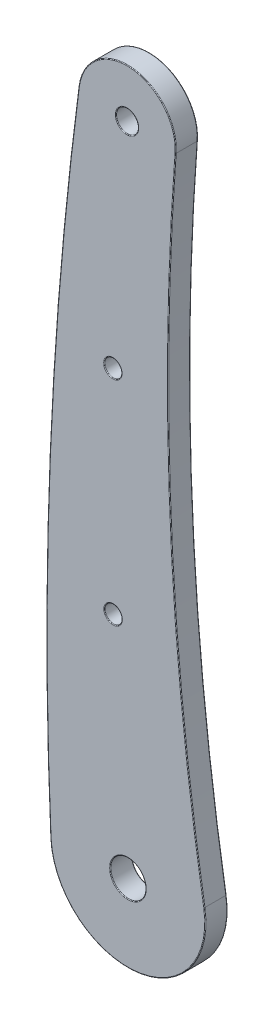
ISO-10303-21;
HEADER;
FILE_DESCRIPTION(('STEP AP214'),'2;1');
FILE_NAME('part.step','',(''),(''),'','','');
FILE_SCHEMA(('AUTOMOTIVE_DESIGN { 1 0 10303 214 1 1 1 1 }'));
ENDSEC;
DATA;
#1=APPLICATION_CONTEXT('core data for automotive mechanical design processes');
#2=APPLICATION_PROTOCOL_DEFINITION('international standard','automotive_design',2000,#1);
#3=PRODUCT_CONTEXT('',#1,'mechanical');
#4=PRODUCT('Part','Part','',(#3));
#5=PRODUCT_RELATED_PRODUCT_CATEGORY('part','',(#4));
#6=PRODUCT_DEFINITION_FORMATION('','',#4);
#7=PRODUCT_DEFINITION_CONTEXT('part definition',#1,'design');
#8=PRODUCT_DEFINITION('design','',#6,#7);
#9=PRODUCT_DEFINITION_SHAPE('','',#8);
#10=(LENGTH_UNIT() NAMED_UNIT(*) SI_UNIT(.MILLI.,.METRE.));
#11=(NAMED_UNIT(*) PLANE_ANGLE_UNIT() SI_UNIT($,.RADIAN.));
#12=(NAMED_UNIT(*) SI_UNIT($,.STERADIAN.) SOLID_ANGLE_UNIT());
#13=UNCERTAINTY_MEASURE_WITH_UNIT(LENGTH_MEASURE(1.E-05),#10,'distance_accuracy_value','');
#14=(GEOMETRIC_REPRESENTATION_CONTEXT(3) GLOBAL_UNCERTAINTY_ASSIGNED_CONTEXT((#13)) GLOBAL_UNIT_ASSIGNED_CONTEXT((#10,
#11,#12)) REPRESENTATION_CONTEXT('',''));
#15=CARTESIAN_POINT('',(0.,0.,0.));
#16=DIRECTION('',(0.,0.,1.));
#17=DIRECTION('',(1.,0.,0.));
#18=AXIS2_PLACEMENT_3D('',#15,#16,#17);
#19=CARTESIAN_POINT('',(-16.0953886048868,338.658157598843,-5.));
#20=DIRECTION('',(0.,0.,1.));
#21=DIRECTION('',(1.,0.,0.));
#22=AXIS2_PLACEMENT_3D('',#19,#20,#21);
#23=CYLINDRICAL_SURFACE('',#22,10.9999999999999);
#24=DIRECTION('',(0.,0.,1.));
#25=VECTOR('',#24,1.);
#26=CARTESIAN_POINT('',(-5.12690314801267,337.826095832905,-5.));
#27=LINE('',#26,#25);
#28=CARTESIAN_POINT('',(-5.12690314801267,337.826095832905,-4.85));
#29=VERTEX_POINT('',#28);
#30=CARTESIAN_POINT('',(-5.12690314801267,337.826095832905,-0.15));
#31=VERTEX_POINT('',#30);
#32=EDGE_CURVE('E105',#29,#31,#27,.T.);
#33=ORIENTED_EDGE('',*,*,#32,.F.);
#34=CARTESIAN_POINT('',(-16.0953886048868,338.658157598843,-4.85));
#35=DIRECTION('',(0.,0.,-1.));
#36=DIRECTION('',(-1.,0.,0.));
#37=AXIS2_PLACEMENT_3D('',#34,#35,#36);
#38=CIRCLE('',#37,10.9999999999999);
#39=CARTESIAN_POINT('',(-27.0011198002621,340.095177812416,-4.85));
#40=VERTEX_POINT('',#39);
#41=EDGE_CURVE('E100',#29,#40,#38,.F.);
#42=ORIENTED_EDGE('',*,*,#41,.T.);
#43=DIRECTION('',(0.,0.,1.));
#44=VECTOR('',#43,1.);
#45=CARTESIAN_POINT('',(-27.0011198002621,340.095177812416,-5.));
#46=LINE('',#45,#44);
#47=CARTESIAN_POINT('',(-27.0011198002621,340.095177812416,-0.15));
#48=VERTEX_POINT('',#47);
#49=EDGE_CURVE('E102',#40,#48,#46,.T.);
#50=ORIENTED_EDGE('',*,*,#49,.T.);
#51=CARTESIAN_POINT('',(-16.0953886048868,338.658157598843,-0.15));
#52=DIRECTION('',(0.,0.,-1.));
#53=DIRECTION('',(-1.,0.,0.));
#54=AXIS2_PLACEMENT_3D('',#51,#52,#53);
#55=CIRCLE('',#54,10.9999999999999);
#56=EDGE_CURVE('E111',#48,#31,#55,.T.);
#57=ORIENTED_EDGE('',*,*,#56,.T.);
#58=EDGE_LOOP('',(#33,#42,#50,#57));
#59=FACE_BOUND('',#58,.T.);
#60=ADVANCED_FACE('F34',(#59),#23,.T.);
#61=CARTESIAN_POINT('',(593.154121772403,292.440908599878,-5.));
#62=DIRECTION('',(0.,0.,1.));
#63=DIRECTION('',(1.,0.,0.));
#64=AXIS2_PLACEMENT_3D('',#61,#62,#63);
#65=CYLINDRICAL_SURFACE('',#64,600.);
#66=DIRECTION('',(0.,0.,1.));
#67=VECTOR('',#66,1.);
#68=CARTESIAN_POINT('',(1.36094250549668,193.542814719524,-5.));
#69=LINE('',#68,#67);
#70=CARTESIAN_POINT('',(1.36094250549668,193.542814719524,-4.85));
#71=VERTEX_POINT('',#70);
#72=CARTESIAN_POINT('',(1.36094250549668,193.542814719524,-0.15));
#73=VERTEX_POINT('',#72);
#74=EDGE_CURVE('E235',#71,#73,#69,.T.);
#75=ORIENTED_EDGE('',*,*,#74,.F.);
#76=CARTESIAN_POINT('',(593.154121772403,292.440908599878,-4.85));
#77=DIRECTION('',(0.,0.,-1.));
#78=DIRECTION('',(-1.,0.,0.));
#79=AXIS2_PLACEMENT_3D('',#76,#77,#78);
#80=CIRCLE('',#79,600.);
#81=EDGE_CURVE('E167',#71,#29,#80,.T.);
#82=ORIENTED_EDGE('',*,*,#81,.T.);
#83=ORIENTED_EDGE('',*,*,#32,.T.);
#84=CARTESIAN_POINT('',(593.154121772403,292.440908599878,-0.15));
#85=DIRECTION('',(0.,0.,-1.));
#86=DIRECTION('',(-1.,0.,0.));
#87=AXIS2_PLACEMENT_3D('',#84,#85,#86);
#88=CIRCLE('',#87,600.);
#89=EDGE_CURVE('E164',#31,#73,#88,.F.);
#90=ORIENTED_EDGE('',*,*,#89,.T.);
#91=EDGE_LOOP('',(#75,#82,#83,#90));
#92=FACE_BOUND('',#91,.T.);
#93=ADVANCED_FACE('F232',(#92),#65,.F.);
#94=CARTESIAN_POINT('',(-15.8996918897889,190.658286981347,-5.));
#95=DIRECTION('',(0.,0.,1.));
#96=DIRECTION('',(1.,0.,0.));
#97=AXIS2_PLACEMENT_3D('',#94,#95,#96);
#98=CYLINDRICAL_SURFACE('',#97,17.5000000000008);
#99=DIRECTION('',(0.,0.,1.));
#100=VECTOR('',#99,1.);
#101=CARTESIAN_POINT('',(-33.3810707222705,189.851197076014,-5.));
#102=LINE('',#101,#100);
#103=CARTESIAN_POINT('',(-33.3810707222705,189.851197076014,-4.85));
#104=VERTEX_POINT('',#103);
#105=CARTESIAN_POINT('',(-33.3810707222705,189.851197076014,-0.15));
#106=VERTEX_POINT('',#105);
#107=EDGE_CURVE('E122',#104,#106,#102,.T.);
#108=ORIENTED_EDGE('',*,*,#107,.F.);
#109=CARTESIAN_POINT('',(-15.8996918897889,190.658286981347,-4.85));
#110=DIRECTION('',(0.,0.,-1.));
#111=DIRECTION('',(-1.,0.,0.));
#112=AXIS2_PLACEMENT_3D('',#109,#110,#111);
#113=CIRCLE('',#112,17.5000000000008);
#114=EDGE_CURVE('E162',#104,#71,#113,.F.);
#115=ORIENTED_EDGE('',*,*,#114,.T.);
#116=ORIENTED_EDGE('',*,*,#74,.T.);
#117=CARTESIAN_POINT('',(-15.8996918897889,190.658286981347,-0.15));
#118=DIRECTION('',(0.,0.,-1.));
#119=DIRECTION('',(-1.,0.,0.));
#120=AXIS2_PLACEMENT_3D('',#117,#118,#119);
#121=CIRCLE('',#120,17.5000000000008);
#122=EDGE_CURVE('E160',#73,#106,#121,.T.);
#123=ORIENTED_EDGE('',*,*,#122,.T.);
#124=EDGE_LOOP('',(#108,#115,#116,#123));
#125=FACE_BOUND('',#124,.T.);
#126=ADVANCED_FACE('F279',(#125),#98,.T.);
#127=CARTESIAN_POINT('',(815.714472569655,229.052706763638,-5.));
#128=DIRECTION('',(0.,0.,1.));
#129=DIRECTION('',(1.,0.,0.));
#130=AXIS2_PLACEMENT_3D('',#127,#128,#129);
#131=CYLINDRICAL_SURFACE('',#130,850.);
#132=ORIENTED_EDGE('',*,*,#49,.F.);
#133=CARTESIAN_POINT('',(815.714472569655,229.052706763638,-4.85));
#134=DIRECTION('',(0.,0.,-1.));
#135=DIRECTION('',(-1.,0.,0.));
#136=AXIS2_PLACEMENT_3D('',#133,#134,#135);
#137=CIRCLE('',#136,850.);
#138=EDGE_CURVE('E118',#40,#104,#137,.F.);
#139=ORIENTED_EDGE('',*,*,#138,.T.);
#140=ORIENTED_EDGE('',*,*,#107,.T.);
#141=CARTESIAN_POINT('',(815.714472569655,229.052706763638,-0.15));
#142=DIRECTION('',(0.,0.,-1.));
#143=DIRECTION('',(-1.,0.,0.));
#144=AXIS2_PLACEMENT_3D('',#141,#142,#143);
#145=CIRCLE('',#144,850.);
#146=EDGE_CURVE('E121',#106,#48,#145,.T.);
#147=ORIENTED_EDGE('',*,*,#146,.T.);
#148=EDGE_LOOP('',(#132,#139,#140,#147));
#149=FACE_BOUND('',#148,.T.);
#150=ADVANCED_FACE('F115',(#149),#131,.T.);
#151=CARTESIAN_POINT('',(288.529366583758,315.549533099361,-5.));
#152=DIRECTION('',(0.,0.,-1.));
#153=DIRECTION('',(-1.,0.,0.));
#154=AXIS2_PLACEMENT_3D('',#151,#152,#153);
#155=PLANE('',#154);
#156=CARTESIAN_POINT('',(-15.8996918897889,190.658286981347,-5.));
#157=DIRECTION('',(0.,0.,-1.));
#158=DIRECTION('',(-1.,0.,0.));
#159=AXIS2_PLACEMENT_3D('',#156,#157,#158);
#160=CIRCLE('',#159,17.3500000000008);
#161=CARTESIAN_POINT('',(1.21299421068002,193.518090196054,-5.));
#162=VERTEX_POINT('',#161);
#163=CARTESIAN_POINT('',(-33.2312303322778,189.858114989488,-5.));
#164=VERTEX_POINT('',#163);
#165=EDGE_CURVE('E156',#162,#164,#160,.T.);
#166=ORIENTED_EDGE('',*,*,#165,.T.);
#167=CARTESIAN_POINT('',(815.714472569655,229.052706763638,-5.));
#168=DIRECTION('',(0.,0.,-1.));
#169=DIRECTION('',(-1.,0.,0.));
#170=AXIS2_PLACEMENT_3D('',#167,#168,#169);
#171=CIRCLE('',#170,849.85);
#172=CARTESIAN_POINT('',(-26.8524052839616,340.075582082231,-5.));
#173=VERTEX_POINT('',#172);
#174=EDGE_CURVE('E158',#164,#173,#171,.T.);
#175=ORIENTED_EDGE('',*,*,#174,.T.);
#176=CARTESIAN_POINT('',(-16.0953886048868,338.658157598843,-5.));
#177=DIRECTION('',(0.,0.,-1.));
#178=DIRECTION('',(-1.,0.,0.));
#179=AXIS2_PLACEMENT_3D('',#176,#177,#178);
#180=CIRCLE('',#179,10.8499999999999);
#181=CARTESIAN_POINT('',(-5.27647340424266,337.837442129713,-5.));
#182=VERTEX_POINT('',#181);
#183=EDGE_CURVE('E128',#173,#182,#180,.T.);
#184=ORIENTED_EDGE('',*,*,#183,.T.);
#185=CARTESIAN_POINT('',(593.154121772403,292.440908599878,-5.));
#186=DIRECTION('',(0.,0.,-1.));
#187=DIRECTION('',(-1.,0.,0.));
#188=AXIS2_PLACEMENT_3D('',#185,#186,#187);
#189=CIRCLE('',#188,600.15);
#190=EDGE_CURVE('E154',#182,#162,#189,.F.);
#191=ORIENTED_EDGE('',*,*,#190,.T.);
#192=EDGE_LOOP('',(#166,#175,#184,#191));
#193=FACE_BOUND('',#192,.T.);
#194=CARTESIAN_POINT('',(-16.0953886048868,338.658157598843,-5.));
#195=DIRECTION('',(0.,0.,-1.));
#196=DIRECTION('',(-1.,0.,0.));
#197=AXIS2_PLACEMENT_3D('',#194,#195,#196);
#198=CIRCLE('',#197,2.65);
#199=CARTESIAN_POINT('',(-18.7453886048868,338.658157598843,-5.));
#200=VERTEX_POINT('',#199);
#201=EDGE_CURVE('E150',#200,#200,#198,.F.);
#202=ORIENTED_EDGE('',*,*,#201,.T.);
#203=EDGE_LOOP('',(#202));
#204=FACE_BOUND('',#203,.T.);
#205=CARTESIAN_POINT('',(-15.8996918897889,190.658286981347,-5.));
#206=DIRECTION('',(0.,0.,-1.));
#207=DIRECTION('',(-1.,0.,0.));
#208=AXIS2_PLACEMENT_3D('',#205,#206,#207);
#209=CIRCLE('',#208,4.14999999999996);
#210=CARTESIAN_POINT('',(-20.0496918897888,190.658286981347,-5.));
#211=VERTEX_POINT('',#210);
#212=EDGE_CURVE('E147',#211,#211,#209,.F.);
#213=ORIENTED_EDGE('',*,*,#212,.T.);
#214=EDGE_LOOP('',(#213));
#215=FACE_BOUND('',#214,.T.);
#216=CARTESIAN_POINT('',(-19.3011857242549,288.770312625675,-5.));
#217=DIRECTION('',(0.,0.,-1.));
#218=DIRECTION('',(-1.,0.,0.));
#219=AXIS2_PLACEMENT_3D('',#216,#217,#218);
#220=CIRCLE('',#219,2.09999999999999);
#221=CARTESIAN_POINT('',(-21.4011857242549,288.770312625675,-5.));
#222=VERTEX_POINT('',#221);
#223=EDGE_CURVE('E141',#222,#222,#220,.F.);
#224=ORIENTED_EDGE('',*,*,#223,.T.);
#225=EDGE_LOOP('',(#224));
#226=FACE_BOUND('',#225,.T.);
#227=CARTESIAN_POINT('',(-19.2414453619087,240.658286981347,-5.));
#228=DIRECTION('',(0.,0.,-1.));
#229=DIRECTION('',(-1.,0.,0.));
#230=AXIS2_PLACEMENT_3D('',#227,#228,#229);
#231=CIRCLE('',#230,2.09999999999999);
#232=CARTESIAN_POINT('',(-21.3414453619087,240.658286981347,-5.));
#233=VERTEX_POINT('',#232);
#234=EDGE_CURVE('E138',#233,#233,#231,.F.);
#235=ORIENTED_EDGE('',*,*,#234,.T.);
#236=EDGE_LOOP('',(#235));
#237=FACE_BOUND('',#236,.T.);
#238=ADVANCED_FACE('F244',(#193,#204,#215,#226,#237),#155,.T.);
#239=CARTESIAN_POINT('',(288.529366583758,315.549533099361,0.));
#240=DIRECTION('',(0.,0.,-1.));
#241=DIRECTION('',(-1.,0.,0.));
#242=AXIS2_PLACEMENT_3D('',#239,#240,#241);
#243=PLANE('',#242);
#244=CARTESIAN_POINT('',(-15.8996918897889,190.658286981347,0.));
#245=DIRECTION('',(0.,0.,-1.));
#246=DIRECTION('',(-1.,0.,0.));
#247=AXIS2_PLACEMENT_3D('',#244,#245,#246);
#248=CIRCLE('',#247,17.3500000000008);
#249=CARTESIAN_POINT('',(-33.2312303322778,189.858114989488,0.));
#250=VERTEX_POINT('',#249);
#251=CARTESIAN_POINT('',(1.21299421067991,193.518090196054,0.));
#252=VERTEX_POINT('',#251);
#253=EDGE_CURVE('E43',#250,#252,#248,.F.);
#254=ORIENTED_EDGE('',*,*,#253,.T.);
#255=CARTESIAN_POINT('',(593.154121772403,292.440908599878,0.));
#256=DIRECTION('',(0.,0.,-1.));
#257=DIRECTION('',(-1.,0.,0.));
#258=AXIS2_PLACEMENT_3D('',#255,#256,#257);
#259=CIRCLE('',#258,600.15);
#260=CARTESIAN_POINT('',(-5.27647340424266,337.837442129713,0.));
#261=VERTEX_POINT('',#260);
#262=EDGE_CURVE('E11',#252,#261,#259,.T.);
#263=ORIENTED_EDGE('',*,*,#262,.T.);
#264=CARTESIAN_POINT('',(-16.0953886048868,338.658157598843,0.));
#265=DIRECTION('',(0.,0.,-1.));
#266=DIRECTION('',(-1.,0.,0.));
#267=AXIS2_PLACEMENT_3D('',#264,#265,#266);
#268=CIRCLE('',#267,10.8499999999999);
#269=CARTESIAN_POINT('',(-26.8524052839616,340.075582082231,0.));
#270=VERTEX_POINT('',#269);
#271=EDGE_CURVE('E205',#261,#270,#268,.F.);
#272=ORIENTED_EDGE('',*,*,#271,.T.);
#273=CARTESIAN_POINT('',(815.714472569655,229.052706763638,0.));
#274=DIRECTION('',(0.,0.,-1.));
#275=DIRECTION('',(-1.,0.,0.));
#276=AXIS2_PLACEMENT_3D('',#273,#274,#275);
#277=CIRCLE('',#276,849.85);
#278=EDGE_CURVE('E54',#270,#250,#277,.F.);
#279=ORIENTED_EDGE('',*,*,#278,.T.);
#280=EDGE_LOOP('',(#254,#263,#272,#279));
#281=FACE_BOUND('',#280,.T.);
#282=CARTESIAN_POINT('',(-16.0953886048868,338.658157598843,0.));
#283=DIRECTION('',(0.,0.,-1.));
#284=DIRECTION('',(-1.,0.,0.));
#285=AXIS2_PLACEMENT_3D('',#282,#283,#284);
#286=CIRCLE('',#285,2.65);
#287=CARTESIAN_POINT('',(-18.7453886048868,338.658157598843,0.));
#288=VERTEX_POINT('',#287);
#289=EDGE_CURVE('E202',#288,#288,#286,.T.);
#290=ORIENTED_EDGE('',*,*,#289,.T.);
#291=EDGE_LOOP('',(#290));
#292=FACE_BOUND('',#291,.T.);
#293=CARTESIAN_POINT('',(-15.8996918897889,190.658286981347,0.));
#294=DIRECTION('',(0.,0.,-1.));
#295=DIRECTION('',(-1.,0.,0.));
#296=AXIS2_PLACEMENT_3D('',#293,#294,#295);
#297=CIRCLE('',#296,4.14999999999996);
#298=CARTESIAN_POINT('',(-20.0496918897888,190.658286981347,0.));
#299=VERTEX_POINT('',#298);
#300=EDGE_CURVE('E199',#299,#299,#297,.T.);
#301=ORIENTED_EDGE('',*,*,#300,.T.);
#302=EDGE_LOOP('',(#301));
#303=FACE_BOUND('',#302,.T.);
#304=CARTESIAN_POINT('',(-19.3011857242549,288.770312625675,0.));
#305=DIRECTION('',(0.,0.,-1.));
#306=DIRECTION('',(-1.,0.,0.));
#307=AXIS2_PLACEMENT_3D('',#304,#305,#306);
#308=CIRCLE('',#307,2.09999999999999);
#309=CARTESIAN_POINT('',(-21.4011857242549,288.770312625675,0.));
#310=VERTEX_POINT('',#309);
#311=EDGE_CURVE('E196',#310,#310,#308,.T.);
#312=ORIENTED_EDGE('',*,*,#311,.T.);
#313=EDGE_LOOP('',(#312));
#314=FACE_BOUND('',#313,.T.);
#315=CARTESIAN_POINT('',(-19.2414453619087,240.658286981347,0.));
#316=DIRECTION('',(0.,0.,-1.));
#317=DIRECTION('',(-1.,0.,0.));
#318=AXIS2_PLACEMENT_3D('',#315,#316,#317);
#319=CIRCLE('',#318,2.09999999999999);
#320=CARTESIAN_POINT('',(-21.3414453619087,240.658286981347,0.));
#321=VERTEX_POINT('',#320);
#322=EDGE_CURVE('E193',#321,#321,#319,.T.);
#323=ORIENTED_EDGE('',*,*,#322,.T.);
#324=EDGE_LOOP('',(#323));
#325=FACE_BOUND('',#324,.T.);
#326=ADVANCED_FACE('F240',(#281,#292,#303,#314,#325),#243,.F.);
#327=CARTESIAN_POINT('',(-16.0953886048868,338.658157598843,-5.));
#328=DIRECTION('',(0.,0.,1.));
#329=DIRECTION('',(1.,0.,0.));
#330=AXIS2_PLACEMENT_3D('',#327,#328,#329);
#331=CYLINDRICAL_SURFACE('',#330,2.5);
#332=CARTESIAN_POINT('',(-16.0953886048868,338.658157598843,-4.85));
#333=DIRECTION('',(0.,0.,-1.));
#334=DIRECTION('',(-1.,0.,0.));
#335=AXIS2_PLACEMENT_3D('',#332,#333,#334);
#336=CIRCLE('',#335,2.5);
#337=CARTESIAN_POINT('',(-18.5953886048868,338.658157598843,-4.85));
#338=VERTEX_POINT('',#337);
#339=EDGE_CURVE('E172',#338,#338,#336,.T.);
#340=ORIENTED_EDGE('',*,*,#339,.T.);
#341=EDGE_LOOP('',(#340));
#342=FACE_BOUND('',#341,.T.);
#343=CARTESIAN_POINT('',(-16.0953886048868,338.658157598843,-0.15));
#344=DIRECTION('',(0.,0.,-1.));
#345=DIRECTION('',(-1.,0.,0.));
#346=AXIS2_PLACEMENT_3D('',#343,#344,#345);
#347=CIRCLE('',#346,2.5);
#348=CARTESIAN_POINT('',(-18.5953886048868,338.658157598843,-0.15));
#349=VERTEX_POINT('',#348);
#350=EDGE_CURVE('E110',#349,#349,#347,.F.);
#351=ORIENTED_EDGE('',*,*,#350,.T.);
#352=EDGE_LOOP('',(#351));
#353=FACE_BOUND('',#352,.T.);
#354=ADVANCED_FACE('F243',(#342,#353),#331,.F.);
#355=CARTESIAN_POINT('',(-15.8996918897889,190.658286981347,-5.));
#356=DIRECTION('',(0.,0.,1.));
#357=DIRECTION('',(1.,0.,0.));
#358=AXIS2_PLACEMENT_3D('',#355,#356,#357);
#359=CYLINDRICAL_SURFACE('',#358,3.99999999999996);
#360=CARTESIAN_POINT('',(-15.8996918897889,190.658286981347,-4.85));
#361=DIRECTION('',(0.,0.,-1.));
#362=DIRECTION('',(-1.,0.,0.));
#363=AXIS2_PLACEMENT_3D('',#360,#361,#362);
#364=CIRCLE('',#363,3.99999999999996);
#365=CARTESIAN_POINT('',(-19.8996918897888,190.658286981347,-4.85));
#366=VERTEX_POINT('',#365);
#367=EDGE_CURVE('E178',#366,#366,#364,.T.);
#368=ORIENTED_EDGE('',*,*,#367,.T.);
#369=EDGE_LOOP('',(#368));
#370=FACE_BOUND('',#369,.T.);
#371=CARTESIAN_POINT('',(-15.8996918897889,190.658286981347,-0.15));
#372=DIRECTION('',(0.,0.,-1.));
#373=DIRECTION('',(-1.,0.,0.));
#374=AXIS2_PLACEMENT_3D('',#371,#372,#373);
#375=CIRCLE('',#374,3.99999999999996);
#376=CARTESIAN_POINT('',(-19.8996918897888,190.658286981347,-0.15));
#377=VERTEX_POINT('',#376);
#378=EDGE_CURVE('E175',#377,#377,#375,.F.);
#379=ORIENTED_EDGE('',*,*,#378,.T.);
#380=EDGE_LOOP('',(#379));
#381=FACE_BOUND('',#380,.T.);
#382=ADVANCED_FACE('F271',(#370,#381),#359,.F.);
#383=CARTESIAN_POINT('',(-19.3011857242549,288.770312625675,0.));
#384=DIRECTION('',(0.,0.,1.));
#385=DIRECTION('',(1.,0.,0.));
#386=AXIS2_PLACEMENT_3D('',#383,#384,#385);
#387=CYLINDRICAL_SURFACE('',#386,1.94999999999999);
#388=CARTESIAN_POINT('',(-19.3011857242549,288.770312625675,-4.85));
#389=DIRECTION('',(0.,0.,-1.));
#390=DIRECTION('',(-1.,0.,0.));
#391=AXIS2_PLACEMENT_3D('',#388,#389,#390);
#392=CIRCLE('',#391,1.94999999999999);
#393=CARTESIAN_POINT('',(-21.2511857242549,288.770312625675,-4.85));
#394=VERTEX_POINT('',#393);
#395=EDGE_CURVE('E184',#394,#394,#392,.T.);
#396=ORIENTED_EDGE('',*,*,#395,.T.);
#397=EDGE_LOOP('',(#396));
#398=FACE_BOUND('',#397,.T.);
#399=CARTESIAN_POINT('',(-19.3011857242549,288.770312625675,-0.15));
#400=DIRECTION('',(0.,0.,-1.));
#401=DIRECTION('',(-1.,0.,0.));
#402=AXIS2_PLACEMENT_3D('',#399,#400,#401);
#403=CIRCLE('',#402,1.94999999999999);
#404=CARTESIAN_POINT('',(-21.2511857242549,288.770312625675,-0.15));
#405=VERTEX_POINT('',#404);
#406=EDGE_CURVE('E181',#405,#405,#403,.F.);
#407=ORIENTED_EDGE('',*,*,#406,.T.);
#408=EDGE_LOOP('',(#407));
#409=FACE_BOUND('',#408,.T.);
#410=ADVANCED_FACE('F262',(#398,#409),#387,.F.);
#411=CARTESIAN_POINT('',(-19.2414453619087,240.658286981347,0.));
#412=DIRECTION('',(0.,0.,1.));
#413=DIRECTION('',(1.,0.,0.));
#414=AXIS2_PLACEMENT_3D('',#411,#412,#413);
#415=CYLINDRICAL_SURFACE('',#414,1.94999999999999);
#416=CARTESIAN_POINT('',(-19.2414453619087,240.658286981347,-4.85));
#417=DIRECTION('',(0.,0.,-1.));
#418=DIRECTION('',(-1.,0.,0.));
#419=AXIS2_PLACEMENT_3D('',#416,#417,#418);
#420=CIRCLE('',#419,1.94999999999999);
#421=CARTESIAN_POINT('',(-21.1914453619087,240.658286981347,-4.85));
#422=VERTEX_POINT('',#421);
#423=EDGE_CURVE('E190',#422,#422,#420,.T.);
#424=ORIENTED_EDGE('',*,*,#423,.T.);
#425=EDGE_LOOP('',(#424));
#426=FACE_BOUND('',#425,.T.);
#427=CARTESIAN_POINT('',(-19.2414453619087,240.658286981347,-0.15));
#428=DIRECTION('',(0.,0.,-1.));
#429=DIRECTION('',(-1.,0.,0.));
#430=AXIS2_PLACEMENT_3D('',#427,#428,#429);
#431=CIRCLE('',#430,1.94999999999999);
#432=CARTESIAN_POINT('',(-21.1914453619087,240.658286981347,-0.15));
#433=VERTEX_POINT('',#432);
#434=EDGE_CURVE('E187',#433,#433,#431,.F.);
#435=ORIENTED_EDGE('',*,*,#434,.T.);
#436=EDGE_LOOP('',(#435));
#437=FACE_BOUND('',#436,.T.);
#438=ADVANCED_FACE('F259',(#426,#437),#415,.F.);
#439=CARTESIAN_POINT('',(593.154121772403,292.440908599878,-4.85));
#440=DIRECTION('',(0.,0.,-1.));
#441=DIRECTION('',(-1.,0.,0.));
#442=AXIS2_PLACEMENT_3D('',#439,#440,#441);
#443=TOROIDAL_SURFACE('',#442,600.15,0.15);
#444=CARTESIAN_POINT('',(1.21299421068002,193.518090196054,-4.85));
#445=DIRECTION('',(0.164830156467111,-0.986321965444868,0.));
#446=DIRECTION('',(0.986321965444868,0.164830156467111,0.));
#447=AXIS2_PLACEMENT_3D('',#444,#445,#446);
#448=CIRCLE('',#447,0.15);
#449=EDGE_CURVE('E132',#162,#71,#448,.T.);
#450=ORIENTED_EDGE('',*,*,#449,.F.);
#451=ORIENTED_EDGE('',*,*,#190,.F.);
#452=CARTESIAN_POINT('',(-5.27647340424278,337.837442129713,-4.85));
#453=DIRECTION('',(0.0756419787217851,0.997135041534021,0.));
#454=DIRECTION('',(-0.997135041534021,0.0756419787217851,0.));
#455=AXIS2_PLACEMENT_3D('',#452,#453,#454);
#456=CIRCLE('',#455,0.15);
#457=EDGE_CURVE('E123',#29,#182,#456,.T.);
#458=ORIENTED_EDGE('',*,*,#457,.F.);
#459=ORIENTED_EDGE('',*,*,#81,.F.);
#460=EDGE_LOOP('',(#450,#451,#458,#459));
#461=FACE_BOUND('',#460,.T.);
#462=ADVANCED_FACE('F261',(#461),#443,.T.);
#463=CARTESIAN_POINT('',(-16.0953886048868,338.658157598843,-4.85));
#464=DIRECTION('',(0.,0.,-1.));
#465=DIRECTION('',(-1.,0.,0.));
#466=AXIS2_PLACEMENT_3D('',#463,#464,#465);
#467=TOROIDAL_SURFACE('',#466,10.8499999999999,0.15);
#468=ORIENTED_EDGE('',*,*,#457,.T.);
#469=ORIENTED_EDGE('',*,*,#183,.F.);
#470=CARTESIAN_POINT('',(-26.8524052839616,340.075582082231,-4.85));
#471=DIRECTION('',(-0.130638201233752,-0.991430108670505,0.));
#472=DIRECTION('',(0.991430108670505,-0.130638201233752,0.));
#473=AXIS2_PLACEMENT_3D('',#470,#471,#472);
#474=CIRCLE('',#473,0.15);
#475=EDGE_CURVE('E126',#40,#173,#474,.T.);
#476=ORIENTED_EDGE('',*,*,#475,.F.);
#477=ORIENTED_EDGE('',*,*,#41,.F.);
#478=EDGE_LOOP('',(#468,#469,#476,#477));
#479=FACE_BOUND('',#478,.T.);
#480=ADVANCED_FACE('F127',(#479),#467,.T.);
#481=CARTESIAN_POINT('',(-15.8996918897889,190.658286981347,-4.85));
#482=DIRECTION('',(0.,0.,-1.));
#483=DIRECTION('',(-1.,0.,0.));
#484=AXIS2_PLACEMENT_3D('',#481,#482,#483);
#485=TOROIDAL_SURFACE('',#484,17.3500000000008,0.15);
#486=ORIENTED_EDGE('',*,*,#449,.T.);
#487=ORIENTED_EDGE('',*,*,#114,.F.);
#488=CARTESIAN_POINT('',(-33.2312303322778,189.858114989488,-4.85));
#489=DIRECTION('',(-0.0461194231619415,0.998935933284617,0.));
#490=DIRECTION('',(-0.998935933284617,-0.0461194231619415,0.));
#491=AXIS2_PLACEMENT_3D('',#488,#489,#490);
#492=CIRCLE('',#491,0.15);
#493=EDGE_CURVE('E133',#164,#104,#492,.T.);
#494=ORIENTED_EDGE('',*,*,#493,.F.);
#495=ORIENTED_EDGE('',*,*,#165,.F.);
#496=EDGE_LOOP('',(#486,#487,#494,#495));
#497=FACE_BOUND('',#496,.T.);
#498=ADVANCED_FACE('F287',(#497),#485,.T.);
#499=CARTESIAN_POINT('',(815.714472569655,229.052706763638,-4.85));
#500=DIRECTION('',(0.,0.,-1.));
#501=DIRECTION('',(-1.,0.,0.));
#502=AXIS2_PLACEMENT_3D('',#499,#500,#501);
#503=TOROIDAL_SURFACE('',#502,849.85,0.15);
#504=ORIENTED_EDGE('',*,*,#475,.T.);
#505=ORIENTED_EDGE('',*,*,#174,.F.);
#506=ORIENTED_EDGE('',*,*,#493,.T.);
#507=ORIENTED_EDGE('',*,*,#138,.F.);
#508=EDGE_LOOP('',(#504,#505,#506,#507));
#509=FACE_BOUND('',#508,.T.);
#510=ADVANCED_FACE('F135',(#509),#503,.T.);
#511=CARTESIAN_POINT('',(-16.0953886048868,338.658157598843,-4.85));
#512=DIRECTION('',(0.,0.,-1.));
#513=DIRECTION('',(-1.,0.,0.));
#514=AXIS2_PLACEMENT_3D('',#511,#512,#513);
#515=TOROIDAL_SURFACE('',#514,2.65,0.15);
#516=ORIENTED_EDGE('',*,*,#339,.F.);
#517=EDGE_LOOP('',(#516));
#518=FACE_BOUND('',#517,.T.);
#519=ORIENTED_EDGE('',*,*,#201,.F.);
#520=EDGE_LOOP('',(#519));
#521=FACE_BOUND('',#520,.T.);
#522=ADVANCED_FACE('F286',(#518,#521),#515,.T.);
#523=CARTESIAN_POINT('',(-15.8996918897889,190.658286981347,-4.85));
#524=DIRECTION('',(0.,0.,-1.));
#525=DIRECTION('',(-1.,0.,0.));
#526=AXIS2_PLACEMENT_3D('',#523,#524,#525);
#527=TOROIDAL_SURFACE('',#526,4.14999999999996,0.15);
#528=ORIENTED_EDGE('',*,*,#367,.F.);
#529=EDGE_LOOP('',(#528));
#530=FACE_BOUND('',#529,.T.);
#531=ORIENTED_EDGE('',*,*,#212,.F.);
#532=EDGE_LOOP('',(#531));
#533=FACE_BOUND('',#532,.T.);
#534=ADVANCED_FACE('F295',(#530,#533),#527,.T.);
#535=CARTESIAN_POINT('',(-19.3011857242549,288.770312625675,-4.85));
#536=DIRECTION('',(0.,0.,-1.));
#537=DIRECTION('',(-1.,0.,0.));
#538=AXIS2_PLACEMENT_3D('',#535,#536,#537);
#539=TOROIDAL_SURFACE('',#538,2.09999999999999,0.15);
#540=ORIENTED_EDGE('',*,*,#223,.F.);
#541=EDGE_LOOP('',(#540));
#542=FACE_BOUND('',#541,.T.);
#543=ORIENTED_EDGE('',*,*,#395,.F.);
#544=EDGE_LOOP('',(#543));
#545=FACE_BOUND('',#544,.T.);
#546=ADVANCED_FACE('F299',(#542,#545),#539,.T.);
#547=CARTESIAN_POINT('',(-19.2414453619087,240.658286981347,-4.85));
#548=DIRECTION('',(0.,0.,-1.));
#549=DIRECTION('',(-1.,0.,0.));
#550=AXIS2_PLACEMENT_3D('',#547,#548,#549);
#551=TOROIDAL_SURFACE('',#550,2.09999999999999,0.15);
#552=ORIENTED_EDGE('',*,*,#234,.F.);
#553=EDGE_LOOP('',(#552));
#554=FACE_BOUND('',#553,.T.);
#555=ORIENTED_EDGE('',*,*,#423,.F.);
#556=EDGE_LOOP('',(#555));
#557=FACE_BOUND('',#556,.T.);
#558=ADVANCED_FACE('F303',(#554,#557),#551,.T.);
#559=CARTESIAN_POINT('',(815.714472569655,229.052706763638,-0.15));
#560=DIRECTION('',(0.,0.,-1.));
#561=DIRECTION('',(-1.,0.,0.));
#562=AXIS2_PLACEMENT_3D('',#559,#560,#561);
#563=TOROIDAL_SURFACE('',#562,849.85,0.15);
#564=CARTESIAN_POINT('',(-26.8524052839615,340.075582082231,-0.15));
#565=DIRECTION('',(0.130638201233752,0.991430108670505,0.));
#566=DIRECTION('',(-0.991430108670505,0.130638201233752,0.));
#567=AXIS2_PLACEMENT_3D('',#564,#565,#566);
#568=CIRCLE('',#567,0.15);
#569=EDGE_CURVE('E216',#48,#270,#568,.T.);
#570=ORIENTED_EDGE('',*,*,#569,.F.);
#571=ORIENTED_EDGE('',*,*,#146,.F.);
#572=CARTESIAN_POINT('',(-33.2312303322778,189.858114989488,-0.15));
#573=DIRECTION('',(0.0461194231619415,-0.998935933284617,0.));
#574=DIRECTION('',(0.998935933284618,0.0461194231619415,0.));
#575=AXIS2_PLACEMENT_3D('',#572,#573,#574);
#576=CIRCLE('',#575,0.15);
#577=EDGE_CURVE('E38',#250,#106,#576,.T.);
#578=ORIENTED_EDGE('',*,*,#577,.F.);
#579=ORIENTED_EDGE('',*,*,#278,.F.);
#580=EDGE_LOOP('',(#570,#571,#578,#579));
#581=FACE_BOUND('',#580,.T.);
#582=ADVANCED_FACE('F226',(#581),#563,.T.);
#583=CARTESIAN_POINT('',(-15.8996918897889,190.658286981347,-0.15));
#584=DIRECTION('',(0.,0.,-1.));
#585=DIRECTION('',(-1.,0.,0.));
#586=AXIS2_PLACEMENT_3D('',#583,#584,#585);
#587=TOROIDAL_SURFACE('',#586,17.3500000000008,0.15);
#588=ORIENTED_EDGE('',*,*,#577,.T.);
#589=ORIENTED_EDGE('',*,*,#122,.F.);
#590=CARTESIAN_POINT('',(1.21299421067991,193.518090196054,-0.15));
#591=DIRECTION('',(-0.164830156467172,0.986321965444858,0.));
#592=DIRECTION('',(-0.986321965444858,-0.164830156467172,0.));
#593=AXIS2_PLACEMENT_3D('',#590,#591,#592);
#594=CIRCLE('',#593,0.15);
#595=EDGE_CURVE('E215',#252,#73,#594,.T.);
#596=ORIENTED_EDGE('',*,*,#595,.F.);
#597=ORIENTED_EDGE('',*,*,#253,.F.);
#598=EDGE_LOOP('',(#588,#589,#596,#597));
#599=FACE_BOUND('',#598,.T.);
#600=ADVANCED_FACE('F224',(#599),#587,.T.);
#601=CARTESIAN_POINT('',(-16.0953886048868,338.658157598843,-0.15));
#602=DIRECTION('',(0.,0.,-1.));
#603=DIRECTION('',(-1.,0.,0.));
#604=AXIS2_PLACEMENT_3D('',#601,#602,#603);
#605=TOROIDAL_SURFACE('',#604,10.8499999999999,0.15);
#606=ORIENTED_EDGE('',*,*,#569,.T.);
#607=ORIENTED_EDGE('',*,*,#271,.F.);
#608=CARTESIAN_POINT('',(-5.27647340424266,337.837442129713,-0.15));
#609=DIRECTION('',(-0.0756419787217851,-0.997135041534021,0.));
#610=DIRECTION('',(0.997135041534021,-0.0756419787217851,0.));
#611=AXIS2_PLACEMENT_3D('',#608,#609,#610);
#612=CIRCLE('',#611,0.15);
#613=EDGE_CURVE('E213',#31,#261,#612,.T.);
#614=ORIENTED_EDGE('',*,*,#613,.F.);
#615=ORIENTED_EDGE('',*,*,#56,.F.);
#616=EDGE_LOOP('',(#606,#607,#614,#615));
#617=FACE_BOUND('',#616,.T.);
#618=ADVANCED_FACE('F228',(#617),#605,.T.);
#619=CARTESIAN_POINT('',(593.154121772403,292.440908599878,-0.15));
#620=DIRECTION('',(0.,0.,-1.));
#621=DIRECTION('',(-1.,0.,0.));
#622=AXIS2_PLACEMENT_3D('',#619,#620,#621);
#623=TOROIDAL_SURFACE('',#622,600.15,0.15);
#624=ORIENTED_EDGE('',*,*,#595,.T.);
#625=ORIENTED_EDGE('',*,*,#89,.F.);
#626=ORIENTED_EDGE('',*,*,#613,.T.);
#627=ORIENTED_EDGE('',*,*,#262,.F.);
#628=EDGE_LOOP('',(#624,#625,#626,#627));
#629=FACE_BOUND('',#628,.T.);
#630=ADVANCED_FACE('F238',(#629),#623,.T.);
#631=CARTESIAN_POINT('',(-16.0953886048868,338.658157598843,-0.15));
#632=DIRECTION('',(0.,0.,-1.));
#633=DIRECTION('',(-1.,0.,0.));
#634=AXIS2_PLACEMENT_3D('',#631,#632,#633);
#635=TOROIDAL_SURFACE('',#634,2.65,0.15);
#636=ORIENTED_EDGE('',*,*,#289,.F.);
#637=EDGE_LOOP('',(#636));
#638=FACE_BOUND('',#637,.T.);
#639=ORIENTED_EDGE('',*,*,#350,.F.);
#640=EDGE_LOOP('',(#639));
#641=FACE_BOUND('',#640,.T.);
#642=ADVANCED_FACE('F310',(#638,#641),#635,.T.);
#643=CARTESIAN_POINT('',(-15.8996918897889,190.658286981347,-0.15));
#644=DIRECTION('',(0.,0.,-1.));
#645=DIRECTION('',(-1.,0.,0.));
#646=AXIS2_PLACEMENT_3D('',#643,#644,#645);
#647=TOROIDAL_SURFACE('',#646,4.14999999999996,0.15);
#648=ORIENTED_EDGE('',*,*,#300,.F.);
#649=EDGE_LOOP('',(#648));
#650=FACE_BOUND('',#649,.T.);
#651=ORIENTED_EDGE('',*,*,#378,.F.);
#652=EDGE_LOOP('',(#651));
#653=FACE_BOUND('',#652,.T.);
#654=ADVANCED_FACE('F319',(#650,#653),#647,.T.);
#655=CARTESIAN_POINT('',(-19.3011857242549,288.770312625675,-0.15));
#656=DIRECTION('',(0.,0.,-1.));
#657=DIRECTION('',(-1.,0.,0.));
#658=AXIS2_PLACEMENT_3D('',#655,#656,#657);
#659=TOROIDAL_SURFACE('',#658,2.09999999999999,0.15);
#660=ORIENTED_EDGE('',*,*,#311,.F.);
#661=EDGE_LOOP('',(#660));
#662=FACE_BOUND('',#661,.T.);
#663=ORIENTED_EDGE('',*,*,#406,.F.);
#664=EDGE_LOOP('',(#663));
#665=FACE_BOUND('',#664,.T.);
#666=ADVANCED_FACE('F256',(#662,#665),#659,.T.);
#667=CARTESIAN_POINT('',(-19.2414453619087,240.658286981347,-0.15));
#668=DIRECTION('',(0.,0.,-1.));
#669=DIRECTION('',(-1.,0.,0.));
#670=AXIS2_PLACEMENT_3D('',#667,#668,#669);
#671=TOROIDAL_SURFACE('',#670,2.09999999999999,0.15);
#672=ORIENTED_EDGE('',*,*,#322,.F.);
#673=EDGE_LOOP('',(#672));
#674=FACE_BOUND('',#673,.T.);
#675=ORIENTED_EDGE('',*,*,#434,.F.);
#676=EDGE_LOOP('',(#675));
#677=FACE_BOUND('',#676,.T.);
#678=ADVANCED_FACE('F36',(#674,#677),#671,.T.);
#679=CLOSED_SHELL('',(#60,#93,#126,#150,#238,#326,#354,#382,#410,#438,#462,#480,#498,#510,#522,
#534,#546,#558,#582,#600,#618,#630,#642,#654,#666,#678));
#680=MANIFOLD_SOLID_BREP('B2',#679);
#681=ADVANCED_BREP_SHAPE_REPRESENTATION('',(#18,#680),#14);
#682=SHAPE_DEFINITION_REPRESENTATION(#9,#681);
ENDSEC;
END-ISO-10303-21;
